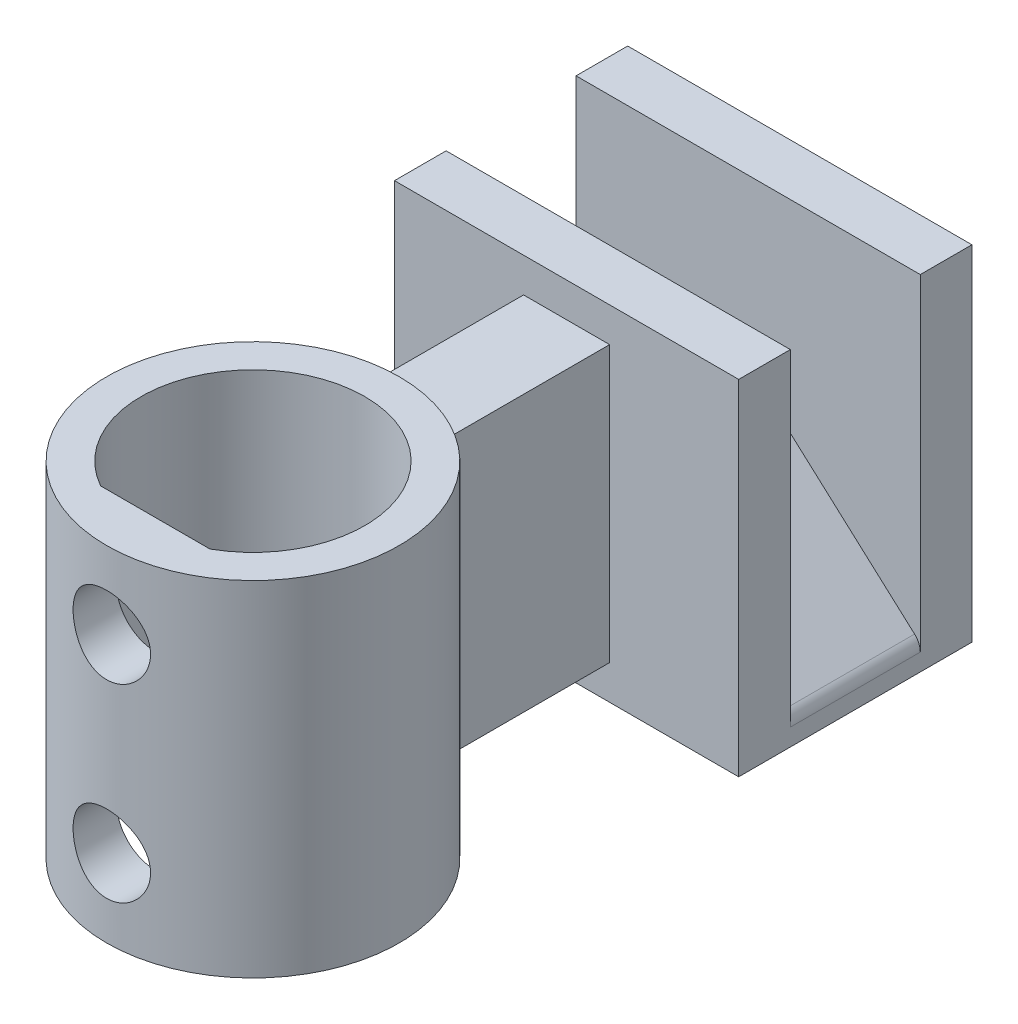
ISO-10303-21;
HEADER;
FILE_DESCRIPTION(('STEP AP214'),'2;1');
FILE_NAME('part.step','',(''),(''),'','','');
FILE_SCHEMA(('AUTOMOTIVE_DESIGN { 1 0 10303 214 1 1 1 1 }'));
ENDSEC;
DATA;
#1=APPLICATION_CONTEXT('core data for automotive mechanical design processes');
#2=APPLICATION_PROTOCOL_DEFINITION('international standard','automotive_design',2000,#1);
#3=PRODUCT_CONTEXT('',#1,'mechanical');
#4=PRODUCT('Part','Part','',(#3));
#5=PRODUCT_RELATED_PRODUCT_CATEGORY('part','',(#4));
#6=PRODUCT_DEFINITION_FORMATION('','',#4);
#7=PRODUCT_DEFINITION_CONTEXT('part definition',#1,'design');
#8=PRODUCT_DEFINITION('design','',#6,#7);
#9=PRODUCT_DEFINITION_SHAPE('','',#8);
#10=(LENGTH_UNIT() NAMED_UNIT(*) SI_UNIT(.MILLI.,.METRE.));
#11=(NAMED_UNIT(*) PLANE_ANGLE_UNIT() SI_UNIT($,.RADIAN.));
#12=(NAMED_UNIT(*) SI_UNIT($,.STERADIAN.) SOLID_ANGLE_UNIT());
#13=UNCERTAINTY_MEASURE_WITH_UNIT(LENGTH_MEASURE(1.E-05),#10,'distance_accuracy_value','');
#14=(GEOMETRIC_REPRESENTATION_CONTEXT(3) GLOBAL_UNCERTAINTY_ASSIGNED_CONTEXT((#13)) GLOBAL_UNIT_ASSIGNED_CONTEXT((#10,
#11,#12)) REPRESENTATION_CONTEXT('',''));
#15=CARTESIAN_POINT('',(0.,0.,0.));
#16=DIRECTION('',(0.,0.,1.));
#17=DIRECTION('',(1.,0.,0.));
#18=AXIS2_PLACEMENT_3D('',#15,#16,#17);
#19=CARTESIAN_POINT('',(0.,39.0416305603426,25.));
#20=DIRECTION('',(0.,-1.,0.));
#21=DIRECTION('',(0.,0.,-1.));
#22=AXIS2_PLACEMENT_3D('',#19,#20,#21);
#23=CYLINDRICAL_SURFACE('',#22,8.5);
#24=CARTESIAN_POINT('',(0.,15.,25.));
#25=DIRECTION('',(0.,-1.,0.));
#26=DIRECTION('',(0.,0.,-1.));
#27=AXIS2_PLACEMENT_3D('',#24,#25,#26);
#28=CIRCLE('',#27,8.5);
#29=CARTESIAN_POINT('',(0.,15.,16.5));
#30=VERTEX_POINT('',#29);
#31=EDGE_CURVE('E186',#30,#30,#28,.T.);
#32=ORIENTED_EDGE('',*,*,#31,.T.);
#33=EDGE_LOOP('',(#32));
#34=FACE_BOUND('',#33,.T.);
#35=CARTESIAN_POINT('',(0.,-5.,25.));
#36=DIRECTION('',(0.,1.,0.));
#37=DIRECTION('',(0.,0.,1.));
#38=AXIS2_PLACEMENT_3D('',#35,#36,#37);
#39=CIRCLE('',#38,8.5);
#40=CARTESIAN_POINT('',(0.,-5.,33.5));
#41=VERTEX_POINT('',#40);
#42=EDGE_CURVE('E192',#41,#41,#39,.F.);
#43=ORIENTED_EDGE('',*,*,#42,.F.);
#44=EDGE_LOOP('',(#43));
#45=FACE_BOUND('',#44,.T.);
#46=CARTESIAN_POINT('',(0.,-3.,25.));
#47=DIRECTION('',(0.,1.,0.));
#48=DIRECTION('',(0.,0.,1.));
#49=AXIS2_PLACEMENT_3D('',#46,#47,#48);
#50=CIRCLE('',#49,8.5);
#51=CARTESIAN_POINT('',(-2.5,-3.,16.875961595364));
#52=VERTEX_POINT('',#51);
#53=CARTESIAN_POINT('',(2.5,-3.,16.875961595364));
#54=VERTEX_POINT('',#53);
#55=EDGE_CURVE('E226',#52,#54,#50,.F.);
#56=ORIENTED_EDGE('',*,*,#55,.T.);
#57=DIRECTION('',(0.,-1.,0.));
#58=VECTOR('',#57,1.);
#59=CARTESIAN_POINT('',(2.5,39.0416305603426,16.875961595364));
#60=LINE('',#59,#58);
#61=CARTESIAN_POINT('',(2.5,13.,16.875961595364));
#62=VERTEX_POINT('',#61);
#63=EDGE_CURVE('E211',#54,#62,#60,.F.);
#64=ORIENTED_EDGE('',*,*,#63,.T.);
#65=CARTESIAN_POINT('',(0.,13.,25.));
#66=DIRECTION('',(0.,-1.,0.));
#67=DIRECTION('',(0.,0.,-1.));
#68=AXIS2_PLACEMENT_3D('',#65,#66,#67);
#69=CIRCLE('',#68,8.5);
#70=CARTESIAN_POINT('',(-2.5,13.,16.875961595364));
#71=VERTEX_POINT('',#70);
#72=EDGE_CURVE('E233',#62,#71,#69,.F.);
#73=ORIENTED_EDGE('',*,*,#72,.T.);
#74=DIRECTION('',(0.,-1.,0.));
#75=VECTOR('',#74,1.);
#76=CARTESIAN_POINT('',(-2.5,39.0416305603426,16.875961595364));
#77=LINE('',#76,#75);
#78=EDGE_CURVE('E230',#71,#52,#77,.T.);
#79=ORIENTED_EDGE('',*,*,#78,.T.);
#80=EDGE_LOOP('',(#56,#64,#73,#79));
#81=FACE_BOUND('',#80,.T.);
#82=CARTESIAN_POINT('',(-2.25,10.5,33.1967981553775));
#83=CARTESIAN_POINT('',(-2.24999694180408,10.6239840002776,33.1968003362435));
#84=CARTESIAN_POINT('',(-2.23971706610501,10.7480005412109,33.1996419584915));
#85=CARTESIAN_POINT('',(-2.198945615888,10.9924544608563,33.2106680196964));
#86=CARTESIAN_POINT('',(-2.16844370713168,11.112889976629,33.2188551904021));
#87=CARTESIAN_POINT('',(-2.0882990785985,11.3466102401079,33.2395815791112));
#88=CARTESIAN_POINT('',(-2.03868300476042,11.459904688051,33.2521147362105));
#89=CARTESIAN_POINT('',(-1.92180166354043,11.6765786826062,33.2801132198881));
#90=CARTESIAN_POINT('',(-1.85453509902009,11.7799574997535,33.2955787619447));
#91=CARTESIAN_POINT('',(-1.70248951742595,11.9764139017784,33.3281265446091));
#92=CARTESIAN_POINT('',(-1.61735395744878,12.0692109081865,33.3452371126252));
#93=CARTESIAN_POINT('',(-1.4327540142738,12.2393902103004,33.3789023677977));
#94=CARTESIAN_POINT('',(-1.33328816547564,12.3167709274061,33.3954569978831));
#95=CARTESIAN_POINT('',(-1.12090838569079,12.4550884366435,33.4264608929721));
#96=CARTESIAN_POINT('',(-1.00780712819347,12.5157466883929,33.4408728427373));
#97=CARTESIAN_POINT('',(-0.772566710508234,12.6170815196129,33.4656427357432));
#98=CARTESIAN_POINT('',(-0.650429055025734,12.6577614172222,33.4760013521304));
#99=CARTESIAN_POINT('',(-0.403511110172187,12.7170778425828,33.4912971460741));
#100=CARTESIAN_POINT('',(-0.278852839843893,12.7361915561904,33.4963515042717));
#101=CARTESIAN_POINT('',(-0.0280034780646866,12.7533339423421,33.5008788349257));
#102=CARTESIAN_POINT('',(0.0981873570184365,12.7513660941808,33.5003527283806));
#103=CARTESIAN_POINT('',(0.34519977639906,12.7267381177659,33.4938644304373));
#104=CARTESIAN_POINT('',(0.466076857336715,12.7045934898765,33.4880376721779));
#105=CARTESIAN_POINT('',(0.702334013138001,12.6410728615727,33.4717623278363));
#106=CARTESIAN_POINT('',(0.817713776487286,12.5996957727456,33.4613134801802));
#107=CARTESIAN_POINT('',(1.04102215095086,12.4984870248307,33.4367663576623));
#108=CARTESIAN_POINT('',(1.14886634833951,12.4384779194592,33.4226332115479));
#109=CARTESIAN_POINT('',(1.3531303740591,12.301844580475,33.3922415251126));
#110=CARTESIAN_POINT('',(1.44954799839656,12.2252171495074,33.375982576028));
#111=CARTESIAN_POINT('',(1.63129857081783,12.0547825542084,33.342521924539));
#112=CARTESIAN_POINT('',(1.71620777876131,11.9605256731685,33.3253065822884));
#113=CARTESIAN_POINT('',(1.86911637013184,11.7589321307718,33.2923181202052));
#114=CARTESIAN_POINT('',(1.93711475347608,11.6515946964081,33.2765450857034));
#115=CARTESIAN_POINT('',(2.05458778503724,11.4259787352489,33.2481731019722));
#116=CARTESIAN_POINT('',(2.10394886477225,11.3076384369629,33.2355937612802));
#117=CARTESIAN_POINT('',(2.18193716023719,11.0639230764637,33.2152779792318));
#118=CARTESIAN_POINT('',(2.21056943128527,10.9385497375025,33.207540357145));
#119=CARTESIAN_POINT('',(2.24556016825425,10.6882860893502,33.1980351929453));
#120=CARTESIAN_POINT('',(2.25255005779307,10.5634903897575,33.1960984643835));
#121=CARTESIAN_POINT('',(2.24579596911986,10.3145136151024,33.1979517680045));
#122=CARTESIAN_POINT('',(2.23205416085442,10.19033247708,33.2017412008412));
#123=CARTESIAN_POINT('',(2.18478304951454,9.94853203437677,33.2144565867633));
#124=CARTESIAN_POINT('',(2.15163187005439,9.83083314067768,33.2232843058655));
#125=CARTESIAN_POINT('',(2.06690749717098,9.60266578735862,33.2449859622244));
#126=CARTESIAN_POINT('',(2.0153319242454,9.49219826384843,33.2578604220901));
#127=CARTESIAN_POINT('',(1.89393612864426,9.27898360406455,33.2865532711528));
#128=CARTESIAN_POINT('',(1.82374430356199,9.17645600255329,33.3024294781708));
#129=CARTESIAN_POINT('',(1.66757023068808,8.98440278488017,33.3352002454647));
#130=CARTESIAN_POINT('',(1.58158505971235,8.89487958119961,33.3520949938724));
#131=CARTESIAN_POINT('',(1.39334723217788,8.72876291555247,33.3855805923336));
#132=CARTESIAN_POINT('',(1.29070161878611,8.65260935870141,33.4021491503459));
#133=CARTESIAN_POINT('',(1.07371678547403,8.51861464758931,33.4326221761272));
#134=CARTESIAN_POINT('',(0.959378187911347,8.46077251937521,33.4465267855714));
#135=CARTESIAN_POINT('',(0.723057226149525,8.36557056201773,33.470015772103));
#136=CARTESIAN_POINT('',(0.60113959611423,8.32805833034544,33.4796321961789));
#137=CARTESIAN_POINT('',(0.352439036803731,8.2741367860407,33.4936022569498));
#138=CARTESIAN_POINT('',(0.225657174963255,8.25772287044393,33.4979570415506));
#139=CARTESIAN_POINT('',(-0.0250604722587875,8.24674873433714,33.5008598374346));
#140=CARTESIAN_POINT('',(-0.148966409472797,8.2515427679478,33.499579436696));
#141=CARTESIAN_POINT('',(-0.394141954180563,8.28135153536109,33.4917428575153));
#142=CARTESIAN_POINT('',(-0.515411657917084,8.30636552970252,33.4851868720061));
#143=CARTESIAN_POINT('',(-0.751107699159933,8.37554121781611,33.4675689262979));
#144=CARTESIAN_POINT('',(-0.865574416324465,8.41957360028427,33.4565374265752));
#145=CARTESIAN_POINT('',(-1.08556048681217,8.5254205314973,33.4311229382255));
#146=CARTESIAN_POINT('',(-1.19107859706731,8.58723754551755,33.4167394850088));
#147=CARTESIAN_POINT('',(-1.39318530515942,8.72879850578497,33.3856885458129));
#148=CARTESIAN_POINT('',(-1.48946543719377,8.80897181418192,33.3689708718519));
#149=CARTESIAN_POINT('',(-1.66742398064291,8.98415288335479,33.3353414220771));
#150=CARTESIAN_POINT('',(-1.74909856114583,9.07916452389294,33.3184295965731));
#151=CARTESIAN_POINT('',(-1.8972708258445,9.2837921479421,33.285906991571));
#152=CARTESIAN_POINT('',(-1.96340296292341,9.39367904330234,33.2703321637851));
#153=CARTESIAN_POINT('',(-2.07615948784757,9.62341015894324,33.2427515934587));
#154=CARTESIAN_POINT('',(-2.12279681152532,9.74324771294936,33.2307434857482));
#155=CARTESIAN_POINT('',(-2.18903256232817,9.96889360228065,33.2133487458215));
#156=CARTESIAN_POINT('',(-2.21184214669942,10.0737109686333,33.2071920574266));
#157=CARTESIAN_POINT('',(-2.24232635318084,10.2856776239988,33.1989160421293));
#158=CARTESIAN_POINT('',(-2.25000264354342,10.3928266546586,33.1967962702092));
#159=CARTESIAN_POINT('',(-2.25,10.5,33.1967981553775));
#160=B_SPLINE_CURVE_WITH_KNOTS('',3,(#82,#83,#84,#85,#86,#87,#88,#89,#90,#91,#92,#93,#94,#95,
#96,#97,#98,#99,#100,#101,#102,#103,#104,#105,#106,#107,#108,#109,#110,#111,#112,#113,#114,#115,
#116,#117,#118,#119,#120,#121,#122,#123,#124,#125,#126,#127,#128,#129,#130,#131,#132,#133,#134,
#135,#136,#137,#138,#139,#140,#141,#142,#143,#144,#145,#146,#147,#148,#149,#150,#151,#152,#153,
#154,#155,#156,#157,#158,#159),.UNSPECIFIED.,.T.,.F.,(4,2,2,2,2,2,2,2,2,2,2,2,2,2,2,2,2,2,2,2,2,
2,2,2,2,2,2,2,2,2,2,2,2,2,2,2,2,2,4),(0.,0.37155797163531,0.743305970231715,1.11453760110695,
1.48579652152091,1.86532086241599,2.24488404596034,2.63043245150024,3.01591680090743,
3.39269333716487,3.76940769129443,4.13675920765004,4.50413151587257,4.87511584526133,
5.24617161521628,5.62845622010334,6.01076342740043,6.3953640456007,6.77987083621654,
7.15304843134813,7.52618696941451,7.89228731518204,8.25843495975225,8.63252754907452,
9.00668944894658,9.39148781847044,9.77626571779774,10.1581177737158,10.539886507824,
10.9101123860205,11.2803247253535,11.6480585642679,12.0158434024024,12.3933170752266,
12.7708896114263,13.156610044578,13.5420741241071,13.8632889681006,14.1844684002793),.UNSPECIFIED.);
#161=CARTESIAN_POINT('',(-2.25,10.5,33.1967981553775));
#162=VERTEX_POINT('',#161);
#163=EDGE_CURVE('E198',#162,#162,#160,.T.);
#164=ORIENTED_EDGE('',*,*,#163,.T.);
#165=EDGE_LOOP('',(#164));
#166=FACE_BOUND('',#165,.T.);
#167=CARTESIAN_POINT('',(-2.25,-0.500000000000002,33.1967981553775));
#168=CARTESIAN_POINT('',(-2.24999694180408,-0.376015999722374,33.1968003362435));
#169=CARTESIAN_POINT('',(-2.23971706610501,-0.251999458789078,33.1996419584915));
#170=CARTESIAN_POINT('',(-2.198945615888,-0.00754553914369019,33.2106680196964));
#171=CARTESIAN_POINT('',(-2.16844370713168,0.112889976628972,33.2188551904021));
#172=CARTESIAN_POINT('',(-2.0882990785985,0.346610240107896,33.2395815791112));
#173=CARTESIAN_POINT('',(-2.03868300476042,0.459904688051024,33.2521147362105));
#174=CARTESIAN_POINT('',(-1.92180166354043,0.676578682606188,33.2801132198881));
#175=CARTESIAN_POINT('',(-1.85453509902009,0.779957499753548,33.2955787619447));
#176=CARTESIAN_POINT('',(-1.70248951742595,0.976413901778359,33.3281265446091));
#177=CARTESIAN_POINT('',(-1.61735395744878,1.06921090818649,33.3452371126252));
#178=CARTESIAN_POINT('',(-1.4327540142738,1.23939021030035,33.3789023677977));
#179=CARTESIAN_POINT('',(-1.33328816547564,1.31677092740614,33.3954569978831));
#180=CARTESIAN_POINT('',(-1.12090838569079,1.45508843664353,33.426460892972));
#181=CARTESIAN_POINT('',(-1.00780712819347,1.51574668839292,33.4408728427372));
#182=CARTESIAN_POINT('',(-0.772566710508234,1.6170815196129,33.4656427357431));
#183=CARTESIAN_POINT('',(-0.650429055025735,1.65776141722221,33.4760013521304));
#184=CARTESIAN_POINT('',(-0.403511110172187,1.71707784258281,33.4912971460741));
#185=CARTESIAN_POINT('',(-0.278852839843893,1.73619155619042,33.4963515042717));
#186=CARTESIAN_POINT('',(-0.0280034780646869,1.75333394234214,33.5008788349257));
#187=CARTESIAN_POINT('',(0.0981873570184361,1.75136609418084,33.5003527283806));
#188=CARTESIAN_POINT('',(0.34519977639906,1.72673811776592,33.4938644304373));
#189=CARTESIAN_POINT('',(0.466076857336715,1.70459348987647,33.4880376721779));
#190=CARTESIAN_POINT('',(0.702334013138001,1.6410728615727,33.4717623278363));
#191=CARTESIAN_POINT('',(0.817713776487285,1.59969577274563,33.4613134801802));
#192=CARTESIAN_POINT('',(1.04102215095086,1.49848702483075,33.4367663576623));
#193=CARTESIAN_POINT('',(1.14886634833951,1.43847791945919,33.4226332115479));
#194=CARTESIAN_POINT('',(1.3531303740591,1.30184458047502,33.3922415251126));
#195=CARTESIAN_POINT('',(1.44954799839656,1.22521714950741,33.375982576028));
#196=CARTESIAN_POINT('',(1.63129857081783,1.05478255420836,33.342521924539));
#197=CARTESIAN_POINT('',(1.71620777876131,0.960525673168511,33.3253065822884));
#198=CARTESIAN_POINT('',(1.86911637013183,0.758932130771777,33.2923181202052));
#199=CARTESIAN_POINT('',(1.93711475347608,0.651594696408099,33.2765450857034));
#200=CARTESIAN_POINT('',(2.05458778503724,0.425978735248875,33.2481731019722));
#201=CARTESIAN_POINT('',(2.10394886477225,0.307638436962872,33.2355937612802));
#202=CARTESIAN_POINT('',(2.18193716023719,0.0639230764637289,33.2152779792318));
#203=CARTESIAN_POINT('',(2.21056943128527,-0.0614502624975041,33.207540357145));
#204=CARTESIAN_POINT('',(2.24556016825425,-0.311713910649751,33.1980351929453));
#205=CARTESIAN_POINT('',(2.25255005779307,-0.436509610242537,33.1960984643835));
#206=CARTESIAN_POINT('',(2.24579596911986,-0.685486384897617,33.1979517680045));
#207=CARTESIAN_POINT('',(2.23205416085442,-0.809667522920008,33.2017412008412));
#208=CARTESIAN_POINT('',(2.18478304951454,-1.05146796562323,33.2144565867633));
#209=CARTESIAN_POINT('',(2.15163187005439,-1.16916685932232,33.2232843058654));
#210=CARTESIAN_POINT('',(2.06690749717098,-1.39733421264138,33.2449859622244));
#211=CARTESIAN_POINT('',(2.0153319242454,-1.50780173615157,33.2578604220901));
#212=CARTESIAN_POINT('',(1.89393612864426,-1.72101639593545,33.2865532711528));
#213=CARTESIAN_POINT('',(1.82374430356199,-1.82354399744671,33.3024294781708));
#214=CARTESIAN_POINT('',(1.66757023068808,-2.01559721511983,33.3352002454647));
#215=CARTESIAN_POINT('',(1.58158505971235,-2.10512041880039,33.3520949938724));
#216=CARTESIAN_POINT('',(1.39334723217788,-2.27123708444753,33.3855805923336));
#217=CARTESIAN_POINT('',(1.29070161878611,-2.34739064129859,33.4021491503459));
#218=CARTESIAN_POINT('',(1.07371678547403,-2.48138535241069,33.4326221761272));
#219=CARTESIAN_POINT('',(0.959378187911347,-2.53922748062479,33.4465267855714));
#220=CARTESIAN_POINT('',(0.723057226149525,-2.63442943798227,33.470015772103));
#221=CARTESIAN_POINT('',(0.60113959611423,-2.67194166965456,33.4796321961789));
#222=CARTESIAN_POINT('',(0.352439036803731,-2.7258632139593,33.4936022569498));
#223=CARTESIAN_POINT('',(0.225657174963256,-2.74227712955607,33.4979570415506));
#224=CARTESIAN_POINT('',(-0.0250604722587871,-2.75325126566286,33.5008598374346));
#225=CARTESIAN_POINT('',(-0.148966409472797,-2.7484572320522,33.499579436696));
#226=CARTESIAN_POINT('',(-0.394141954180563,-2.71864846463891,33.4917428575153));
#227=CARTESIAN_POINT('',(-0.515411657917083,-2.69363447029748,33.4851868720061));
#228=CARTESIAN_POINT('',(-0.751107699159933,-2.62445878218389,33.4675689262979));
#229=CARTESIAN_POINT('',(-0.865574416324465,-2.58042639971573,33.4565374265752));
#230=CARTESIAN_POINT('',(-1.08556048681217,-2.4745794685027,33.4311229382255));
#231=CARTESIAN_POINT('',(-1.19107859706731,-2.41276245448245,33.4167394850088));
#232=CARTESIAN_POINT('',(-1.39318530515942,-2.27120149421503,33.3856885458129));
#233=CARTESIAN_POINT('',(-1.48946543719377,-2.19102818581808,33.3689708718519));
#234=CARTESIAN_POINT('',(-1.66742398064291,-2.01584711664521,33.3353414220771));
#235=CARTESIAN_POINT('',(-1.74909856114582,-1.92083547610706,33.3184295965731));
#236=CARTESIAN_POINT('',(-1.8972708258445,-1.7162078520579,33.285906991571));
#237=CARTESIAN_POINT('',(-1.96340296292341,-1.60632095669767,33.2703321637851));
#238=CARTESIAN_POINT('',(-2.07615948784757,-1.37658984105676,33.2427515934587));
#239=CARTESIAN_POINT('',(-2.12279681152532,-1.25675228705065,33.2307434857482));
#240=CARTESIAN_POINT('',(-2.18903256232817,-1.03110639771935,33.2133487458215));
#241=CARTESIAN_POINT('',(-2.21184214669942,-0.92628903136672,33.2071920574266));
#242=CARTESIAN_POINT('',(-2.24232635318084,-0.714322376001232,33.1989160421293));
#243=CARTESIAN_POINT('',(-2.25000264354342,-0.607173345341352,33.1967962702092));
#244=CARTESIAN_POINT('',(-2.25,-0.500000000000002,33.1967981553775));
#245=B_SPLINE_CURVE_WITH_KNOTS('',3,(#167,#168,#169,#170,#171,#172,#173,#174,#175,#176,#177,
#178,#179,#180,#181,#182,#183,#184,#185,#186,#187,#188,#189,#190,#191,#192,#193,#194,#195,#196,
#197,#198,#199,#200,#201,#202,#203,#204,#205,#206,#207,#208,#209,#210,#211,#212,#213,#214,#215,
#216,#217,#218,#219,#220,#221,#222,#223,#224,#225,#226,#227,#228,#229,#230,#231,#232,#233,#234,
#235,#236,#237,#238,#239,#240,#241,#242,#243,#244),.UNSPECIFIED.,.T.,.F.,(4,2,2,2,2,2,2,2,2,2,2,
2,2,2,2,2,2,2,2,2,2,2,2,2,2,2,2,2,2,2,2,2,2,2,2,2,2,2,4),(0.,0.371557971635309,
0.743305970231715,1.11453760110695,1.48579652152091,1.86532086241599,2.24488404596033,
2.63043245150024,3.01591680090743,3.39269333716487,3.76940769129443,4.13675920765004,
4.50413151587256,4.87511584526133,5.24617161521628,5.62845622010334,6.01076342740043,
6.3953640456007,6.77987083621654,7.15304843134812,7.5261869694145,7.89228731518204,
8.25843495975225,8.63252754907452,9.00668944894658,9.39148781847044,9.77626571779773,
10.1581177737158,10.539886507824,10.9101123860205,11.2803247253535,11.6480585642679,
12.0158434024024,12.3933170752266,12.7708896114263,13.156610044578,13.5420741241071,
13.8632889681006,14.1844684002793),.UNSPECIFIED.);
#246=CARTESIAN_POINT('',(-2.25,-0.500000000000002,33.1967981553775));
#247=VERTEX_POINT('',#246);
#248=EDGE_CURVE('E616',#247,#247,#245,.T.);
#249=ORIENTED_EDGE('',*,*,#248,.T.);
#250=EDGE_LOOP('',(#249));
#251=FACE_BOUND('',#250,.T.);
#252=ADVANCED_FACE('F35',(#34,#45,#81,#166,#251),#23,.T.);
#253=CARTESIAN_POINT('',(0.,0.,6.775));
#254=DIRECTION('',(0.,0.,1.));
#255=DIRECTION('',(1.,0.,0.));
#256=AXIS2_PLACEMENT_3D('',#253,#254,#255);
#257=PLANE('',#256);
#258=DIRECTION('',(0.,1.,0.));
#259=VECTOR('',#258,1.);
#260=CARTESIAN_POINT('',(10.,15.,6.775));
#261=LINE('',#260,#259);
#262=CARTESIAN_POINT('',(10.,-5.,6.775));
#263=VERTEX_POINT('',#262);
#264=CARTESIAN_POINT('',(10.,15.,6.775));
#265=VERTEX_POINT('',#264);
#266=EDGE_CURVE('E263',#263,#265,#261,.T.);
#267=ORIENTED_EDGE('',*,*,#266,.T.);
#268=DIRECTION('',(-1.,0.,0.));
#269=VECTOR('',#268,1.);
#270=CARTESIAN_POINT('',(-10.,15.,6.775));
#271=LINE('',#270,#269);
#272=CARTESIAN_POINT('',(-10.,15.,6.775));
#273=VERTEX_POINT('',#272);
#274=EDGE_CURVE('E266',#265,#273,#271,.T.);
#275=ORIENTED_EDGE('',*,*,#274,.T.);
#276=DIRECTION('',(0.,-1.,0.));
#277=VECTOR('',#276,1.);
#278=CARTESIAN_POINT('',(-10.,15.,6.775));
#279=LINE('',#278,#277);
#280=CARTESIAN_POINT('',(-10.,-5.,6.775));
#281=VERTEX_POINT('',#280);
#282=EDGE_CURVE('E269',#273,#281,#279,.T.);
#283=ORIENTED_EDGE('',*,*,#282,.T.);
#284=DIRECTION('',(1.,0.,0.));
#285=VECTOR('',#284,1.);
#286=CARTESIAN_POINT('',(-10.,-5.,6.775));
#287=LINE('',#286,#285);
#288=EDGE_CURVE('E272',#281,#263,#287,.T.);
#289=ORIENTED_EDGE('',*,*,#288,.T.);
#290=EDGE_LOOP('',(#267,#275,#283,#289));
#291=FACE_BOUND('',#290,.T.);
#292=DIRECTION('',(-1.,0.,0.));
#293=VECTOR('',#292,1.);
#294=CARTESIAN_POINT('',(-2.5,13.,6.775));
#295=LINE('',#294,#293);
#296=CARTESIAN_POINT('',(2.5,13.,6.775));
#297=VERTEX_POINT('',#296);
#298=CARTESIAN_POINT('',(-2.5,13.,6.775));
#299=VERTEX_POINT('',#298);
#300=EDGE_CURVE('E215',#297,#299,#295,.T.);
#301=ORIENTED_EDGE('',*,*,#300,.F.);
#302=DIRECTION('',(0.,1.,0.));
#303=VECTOR('',#302,1.);
#304=CARTESIAN_POINT('',(2.5,13.,6.775));
#305=LINE('',#304,#303);
#306=CARTESIAN_POINT('',(2.5,-3.,6.775));
#307=VERTEX_POINT('',#306);
#308=EDGE_CURVE('E219',#307,#297,#305,.T.);
#309=ORIENTED_EDGE('',*,*,#308,.F.);
#310=DIRECTION('',(1.,0.,0.));
#311=VECTOR('',#310,1.);
#312=CARTESIAN_POINT('',(-2.5,-3.,6.775));
#313=LINE('',#312,#311);
#314=CARTESIAN_POINT('',(-2.5,-3.,6.775));
#315=VERTEX_POINT('',#314);
#316=EDGE_CURVE('E208',#315,#307,#313,.T.);
#317=ORIENTED_EDGE('',*,*,#316,.F.);
#318=DIRECTION('',(0.,-1.,0.));
#319=VECTOR('',#318,1.);
#320=CARTESIAN_POINT('',(-2.5,13.,6.775));
#321=LINE('',#320,#319);
#322=EDGE_CURVE('E52',#299,#315,#321,.T.);
#323=ORIENTED_EDGE('',*,*,#322,.F.);
#324=EDGE_LOOP('',(#301,#309,#317,#323));
#325=FACE_BOUND('',#324,.T.);
#326=ADVANCED_FACE('F396',(#291,#325),#257,.T.);
#327=CARTESIAN_POINT('',(10.,-5.,3.775));
#328=DIRECTION('',(-1.,0.,0.));
#329=DIRECTION('',(0.,0.,1.));
#330=AXIS2_PLACEMENT_3D('',#327,#328,#329);
#331=PLANE('',#330);
#332=DIRECTION('',(0.,0.,-1.));
#333=VECTOR('',#332,1.);
#334=CARTESIAN_POINT('',(10.,-5.,3.775));
#335=LINE('',#334,#333);
#336=CARTESIAN_POINT('',(10.,-5.,-6.775));
#337=VERTEX_POINT('',#336);
#338=EDGE_CURVE('E290',#263,#337,#335,.T.);
#339=ORIENTED_EDGE('',*,*,#338,.T.);
#340=DIRECTION('',(0.,1.,0.));
#341=VECTOR('',#340,1.);
#342=CARTESIAN_POINT('',(10.,15.,-6.775));
#343=LINE('',#342,#341);
#344=CARTESIAN_POINT('',(10.,15.,-6.775));
#345=VERTEX_POINT('',#344);
#346=EDGE_CURVE('E238',#337,#345,#343,.T.);
#347=ORIENTED_EDGE('',*,*,#346,.T.);
#348=DIRECTION('',(0.,0.,1.));
#349=VECTOR('',#348,1.);
#350=CARTESIAN_POINT('',(10.,15.,-6.775));
#351=LINE('',#350,#349);
#352=CARTESIAN_POINT('',(10.,15.,-3.775));
#353=VERTEX_POINT('',#352);
#354=EDGE_CURVE('E251',#345,#353,#351,.T.);
#355=ORIENTED_EDGE('',*,*,#354,.T.);
#356=DIRECTION('',(0.,1.,0.));
#357=VECTOR('',#356,1.);
#358=CARTESIAN_POINT('',(10.,15.,-3.775));
#359=LINE('',#358,#357);
#360=CARTESIAN_POINT('',(10.,-3.99906710613801,-3.775));
#361=VERTEX_POINT('',#360);
#362=EDGE_CURVE('E229',#361,#353,#359,.T.);
#363=ORIENTED_EDGE('',*,*,#362,.F.);
#364=DIRECTION('',(0.,0.,-1.));
#365=VECTOR('',#364,1.);
#366=CARTESIAN_POINT('',(10.,-3.99906710613801,3.775));
#367=LINE('',#366,#365);
#368=CARTESIAN_POINT('',(10.,-3.99906710613801,3.775));
#369=VERTEX_POINT('',#368);
#370=EDGE_CURVE('E336',#361,#369,#367,.F.);
#371=ORIENTED_EDGE('',*,*,#370,.T.);
#372=DIRECTION('',(0.,1.,0.));
#373=VECTOR('',#372,1.);
#374=CARTESIAN_POINT('',(10.,15.,3.775));
#375=LINE('',#374,#373);
#376=CARTESIAN_POINT('',(10.,15.,3.775));
#377=VERTEX_POINT('',#376);
#378=EDGE_CURVE('E262',#369,#377,#375,.T.);
#379=ORIENTED_EDGE('',*,*,#378,.T.);
#380=DIRECTION('',(0.,0.,-1.));
#381=VECTOR('',#380,1.);
#382=CARTESIAN_POINT('',(10.,15.,6.775));
#383=LINE('',#382,#381);
#384=EDGE_CURVE('E283',#265,#377,#383,.T.);
#385=ORIENTED_EDGE('',*,*,#384,.F.);
#386=ORIENTED_EDGE('',*,*,#266,.F.);
#387=EDGE_LOOP('',(#339,#347,#355,#363,#371,#379,#385,#386));
#388=FACE_BOUND('',#387,.T.);
#389=ADVANCED_FACE('F374',(#388),#331,.F.);
#390=CARTESIAN_POINT('',(-10.,5.,3.775));
#391=DIRECTION('',(0.,-1.,0.));
#392=DIRECTION('',(0.,0.,-1.));
#393=AXIS2_PLACEMENT_3D('',#390,#391,#392);
#394=PLANE('',#393);
#395=DIRECTION('',(-1.,0.,0.));
#396=VECTOR('',#395,1.);
#397=CARTESIAN_POINT('',(-10.,5.,3.775));
#398=LINE('',#397,#396);
#399=CARTESIAN_POINT('',(0.116135964964558,5.,3.775));
#400=VERTEX_POINT('',#399);
#401=CARTESIAN_POINT('',(-0.116135964964551,5.,3.775));
#402=VERTEX_POINT('',#401);
#403=EDGE_CURVE('E287',#400,#402,#398,.T.);
#404=ORIENTED_EDGE('',*,*,#403,.F.);
#405=DIRECTION('',(0.,0.,1.));
#406=VECTOR('',#405,1.);
#407=CARTESIAN_POINT('',(0.116135964964558,5.,-3.775));
#408=LINE('',#407,#406);
#409=CARTESIAN_POINT('',(0.116135964964558,5.,-3.775));
#410=VERTEX_POINT('',#409);
#411=EDGE_CURVE('E11',#400,#410,#408,.F.);
#412=ORIENTED_EDGE('',*,*,#411,.T.);
#413=DIRECTION('',(-1.,0.,0.));
#414=VECTOR('',#413,1.);
#415=CARTESIAN_POINT('',(-10.,5.,-3.775));
#416=LINE('',#415,#414);
#417=CARTESIAN_POINT('',(-0.116135964964551,5.,-3.775));
#418=VERTEX_POINT('',#417);
#419=EDGE_CURVE('E286',#410,#418,#416,.T.);
#420=ORIENTED_EDGE('',*,*,#419,.T.);
#421=DIRECTION('',(0.,0.,-1.));
#422=VECTOR('',#421,1.);
#423=CARTESIAN_POINT('',(-0.116135964964551,5.,3.775));
#424=LINE('',#423,#422);
#425=EDGE_CURVE('E44',#418,#402,#424,.F.);
#426=ORIENTED_EDGE('',*,*,#425,.T.);
#427=EDGE_LOOP('',(#404,#412,#420,#426));
#428=FACE_BOUND('',#427,.T.);
#429=ADVANCED_FACE('F344',(#428),#394,.F.);
#430=CARTESIAN_POINT('',(-10.,-5.,3.775));
#431=DIRECTION('',(1.,0.,0.));
#432=DIRECTION('',(0.,0.,-1.));
#433=AXIS2_PLACEMENT_3D('',#430,#431,#432);
#434=PLANE('',#433);
#435=DIRECTION('',(0.,0.,-1.));
#436=VECTOR('',#435,1.);
#437=CARTESIAN_POINT('',(-10.,-5.,3.775));
#438=LINE('',#437,#436);
#439=CARTESIAN_POINT('',(-10.,-5.,-6.775));
#440=VERTEX_POINT('',#439);
#441=EDGE_CURVE('E293',#281,#440,#438,.T.);
#442=ORIENTED_EDGE('',*,*,#441,.F.);
#443=ORIENTED_EDGE('',*,*,#282,.F.);
#444=DIRECTION('',(0.,0.,-1.));
#445=VECTOR('',#444,1.);
#446=CARTESIAN_POINT('',(-10.,15.,6.775));
#447=LINE('',#446,#445);
#448=CARTESIAN_POINT('',(-10.,15.,3.775));
#449=VERTEX_POINT('',#448);
#450=EDGE_CURVE('E275',#273,#449,#447,.T.);
#451=ORIENTED_EDGE('',*,*,#450,.T.);
#452=DIRECTION('',(0.,-1.,0.));
#453=VECTOR('',#452,1.);
#454=CARTESIAN_POINT('',(-10.,15.,3.775));
#455=LINE('',#454,#453);
#456=CARTESIAN_POINT('',(-10.,-3.99906710613801,3.775));
#457=VERTEX_POINT('',#456);
#458=EDGE_CURVE('E267',#449,#457,#455,.T.);
#459=ORIENTED_EDGE('',*,*,#458,.T.);
#460=DIRECTION('',(0.,0.,1.));
#461=VECTOR('',#460,1.);
#462=CARTESIAN_POINT('',(-10.,-3.99906710613801,-3.775));
#463=LINE('',#462,#461);
#464=CARTESIAN_POINT('',(-10.,-3.99906710613801,-3.775));
#465=VERTEX_POINT('',#464);
#466=EDGE_CURVE('E307',#457,#465,#463,.F.);
#467=ORIENTED_EDGE('',*,*,#466,.T.);
#468=DIRECTION('',(0.,-1.,0.));
#469=VECTOR('',#468,1.);
#470=CARTESIAN_POINT('',(-10.,15.,-3.775));
#471=LINE('',#470,#469);
#472=CARTESIAN_POINT('',(-10.,15.,-3.775));
#473=VERTEX_POINT('',#472);
#474=EDGE_CURVE('E253',#473,#465,#471,.T.);
#475=ORIENTED_EDGE('',*,*,#474,.F.);
#476=DIRECTION('',(0.,0.,1.));
#477=VECTOR('',#476,1.);
#478=CARTESIAN_POINT('',(-10.,15.,-6.775));
#479=LINE('',#478,#477);
#480=CARTESIAN_POINT('',(-10.,15.,-6.775));
#481=VERTEX_POINT('',#480);
#482=EDGE_CURVE('E260',#481,#473,#479,.T.);
#483=ORIENTED_EDGE('',*,*,#482,.F.);
#484=DIRECTION('',(0.,-1.,0.));
#485=VECTOR('',#484,1.);
#486=CARTESIAN_POINT('',(-10.,15.,-6.775));
#487=LINE('',#486,#485);
#488=EDGE_CURVE('E245',#481,#440,#487,.T.);
#489=ORIENTED_EDGE('',*,*,#488,.T.);
#490=EDGE_LOOP('',(#442,#443,#451,#459,#467,#475,#483,#489));
#491=FACE_BOUND('',#490,.T.);
#492=ADVANCED_FACE('F365',(#491),#434,.F.);
#493=CARTESIAN_POINT('',(-10.,-5.,3.775));
#494=DIRECTION('',(0.,1.,0.));
#495=DIRECTION('',(0.,0.,1.));
#496=AXIS2_PLACEMENT_3D('',#493,#494,#495);
#497=PLANE('',#496);
#498=ORIENTED_EDGE('',*,*,#441,.T.);
#499=DIRECTION('',(1.,0.,0.));
#500=VECTOR('',#499,1.);
#501=CARTESIAN_POINT('',(-10.,-5.,-6.775));
#502=LINE('',#501,#500);
#503=EDGE_CURVE('E241',#440,#337,#502,.T.);
#504=ORIENTED_EDGE('',*,*,#503,.T.);
#505=ORIENTED_EDGE('',*,*,#338,.F.);
#506=ORIENTED_EDGE('',*,*,#288,.F.);
#507=EDGE_LOOP('',(#498,#504,#505,#506));
#508=FACE_BOUND('',#507,.T.);
#509=ADVANCED_FACE('F384',(#508),#497,.F.);
#510=CARTESIAN_POINT('',(0.499999999999971,5.,3.775));
#511=DIRECTION('',(-0.669130606358857,-0.743144825477395,0.));
#512=DIRECTION('',(0.,0.,-1.));
#513=AXIS2_PLACEMENT_3D('',#510,#511,#512);
#514=PLANE('',#513);
#515=DIRECTION('',(0.743144825477395,-0.669130606358857,0.));
#516=VECTOR('',#515,1.);
#517=CARTESIAN_POINT('',(0.499999999999971,5.,3.775));
#518=LINE('',#517,#516);
#519=CARTESIAN_POINT('',(9.66913060635886,-3.25592228066062,3.775));
#520=VERTEX_POINT('',#519);
#521=CARTESIAN_POINT('',(0.785266571323414,4.7431448254774,3.775));
#522=VERTEX_POINT('',#521);
#523=EDGE_CURVE('E304',#520,#522,#518,.F.);
#524=ORIENTED_EDGE('',*,*,#523,.F.);
#525=DIRECTION('',(0.,0.,1.));
#526=VECTOR('',#525,1.);
#527=CARTESIAN_POINT('',(9.66913060635886,-3.25592228066062,-3.775));
#528=LINE('',#527,#526);
#529=CARTESIAN_POINT('',(9.66913060635886,-3.25592228066062,-3.775));
#530=VERTEX_POINT('',#529);
#531=EDGE_CURVE('E341',#520,#530,#528,.F.);
#532=ORIENTED_EDGE('',*,*,#531,.T.);
#533=DIRECTION('',(-0.743144825477395,0.669130606358857,0.));
#534=VECTOR('',#533,1.);
#535=CARTESIAN_POINT('',(2.71017262260376,3.0099516320112,-3.775));
#536=LINE('',#535,#534);
#537=CARTESIAN_POINT('',(0.785266571323414,4.7431448254774,-3.775));
#538=VERTEX_POINT('',#537);
#539=EDGE_CURVE('E298',#538,#530,#536,.F.);
#540=ORIENTED_EDGE('',*,*,#539,.F.);
#541=DIRECTION('',(0.,0.,-1.));
#542=VECTOR('',#541,1.);
#543=CARTESIAN_POINT('',(0.785266571323414,4.7431448254774,3.775));
#544=LINE('',#543,#542);
#545=EDGE_CURVE('E339',#538,#522,#544,.F.);
#546=ORIENTED_EDGE('',*,*,#545,.T.);
#547=EDGE_LOOP('',(#524,#532,#540,#546));
#548=FACE_BOUND('',#547,.T.);
#549=ADVANCED_FACE('F382',(#548),#514,.F.);
#550=CARTESIAN_POINT('',(-10.,-3.55383842082948,3.775));
#551=DIRECTION('',(0.669130606358857,-0.743144825477395,0.));
#552=DIRECTION('',(0.,0.,-1.));
#553=AXIS2_PLACEMENT_3D('',#550,#551,#552);
#554=PLANE('',#553);
#555=DIRECTION('',(-0.743144825477395,-0.669130606358857,0.));
#556=VECTOR('',#555,1.);
#557=CARTESIAN_POINT('',(-2.71017262260375,3.00995163201119,-3.775));
#558=LINE('',#557,#556);
#559=CARTESIAN_POINT('',(-9.66913060635885,-3.25592228066062,-3.775));
#560=VERTEX_POINT('',#559);
#561=CARTESIAN_POINT('',(-0.785266571323407,4.74314482547739,-3.775));
#562=VERTEX_POINT('',#561);
#563=EDGE_CURVE('E295',#560,#562,#558,.F.);
#564=ORIENTED_EDGE('',*,*,#563,.F.);
#565=DIRECTION('',(0.,0.,-1.));
#566=VECTOR('',#565,1.);
#567=CARTESIAN_POINT('',(-9.66913060635885,-3.25592228066062,3.775));
#568=LINE('',#567,#566);
#569=CARTESIAN_POINT('',(-9.66913060635885,-3.25592228066062,3.775));
#570=VERTEX_POINT('',#569);
#571=EDGE_CURVE('E324',#560,#570,#568,.F.);
#572=ORIENTED_EDGE('',*,*,#571,.T.);
#573=DIRECTION('',(0.743144825477395,0.669130606358857,0.));
#574=VECTOR('',#573,1.);
#575=CARTESIAN_POINT('',(-10.,-3.55383842082948,3.775));
#576=LINE('',#575,#574);
#577=CARTESIAN_POINT('',(-0.785266571323407,4.7431448254774,3.775));
#578=VERTEX_POINT('',#577);
#579=EDGE_CURVE('E301',#578,#570,#576,.F.);
#580=ORIENTED_EDGE('',*,*,#579,.F.);
#581=DIRECTION('',(0.,0.,1.));
#582=VECTOR('',#581,1.);
#583=CARTESIAN_POINT('',(-0.785266571323407,4.7431448254774,-3.775));
#584=LINE('',#583,#582);
#585=EDGE_CURVE('E322',#578,#562,#584,.F.);
#586=ORIENTED_EDGE('',*,*,#585,.T.);
#587=EDGE_LOOP('',(#564,#572,#580,#586));
#588=FACE_BOUND('',#587,.T.);
#589=ADVANCED_FACE('F358',(#588),#554,.F.);
#590=CARTESIAN_POINT('',(-9.,-3.99906710613801,3.775));
#591=DIRECTION('',(0.,0.,-1.));
#592=DIRECTION('',(-1.,0.,0.));
#593=AXIS2_PLACEMENT_3D('',#590,#591,#592);
#594=CYLINDRICAL_SURFACE('',#593,1.);
#595=CARTESIAN_POINT('',(-9.,-3.99906710613801,3.775));
#596=DIRECTION('',(0.,0.,-1.));
#597=DIRECTION('',(-1.,0.,0.));
#598=AXIS2_PLACEMENT_3D('',#595,#596,#597);
#599=CIRCLE('',#598,1.);
#600=EDGE_CURVE('E333',#570,#457,#599,.F.);
#601=ORIENTED_EDGE('',*,*,#600,.F.);
#602=ORIENTED_EDGE('',*,*,#571,.F.);
#603=CARTESIAN_POINT('',(-9.,-3.99906710613801,-3.775));
#604=DIRECTION('',(0.,0.,-1.));
#605=DIRECTION('',(-1.,0.,0.));
#606=AXIS2_PLACEMENT_3D('',#603,#604,#605);
#607=CIRCLE('',#606,1.);
#608=EDGE_CURVE('E319',#465,#560,#607,.T.);
#609=ORIENTED_EDGE('',*,*,#608,.F.);
#610=ORIENTED_EDGE('',*,*,#466,.F.);
#611=EDGE_LOOP('',(#601,#602,#609,#610));
#612=FACE_BOUND('',#611,.T.);
#613=ADVANCED_FACE('F390',(#612),#594,.T.);
#614=CARTESIAN_POINT('',(9.00000000000001,-3.99906710613801,3.775));
#615=DIRECTION('',(0.,0.,1.));
#616=DIRECTION('',(1.,0.,0.));
#617=AXIS2_PLACEMENT_3D('',#614,#615,#616);
#618=CYLINDRICAL_SURFACE('',#617,1.);
#619=CARTESIAN_POINT('',(9.00000000000001,-3.99906710613801,-3.775));
#620=DIRECTION('',(0.,0.,-1.));
#621=DIRECTION('',(-1.,0.,0.));
#622=AXIS2_PLACEMENT_3D('',#619,#620,#621);
#623=CIRCLE('',#622,1.);
#624=EDGE_CURVE('E316',#530,#361,#623,.T.);
#625=ORIENTED_EDGE('',*,*,#624,.F.);
#626=ORIENTED_EDGE('',*,*,#531,.F.);
#627=CARTESIAN_POINT('',(9.00000000000001,-3.99906710613801,3.775));
#628=DIRECTION('',(0.,0.,-1.));
#629=DIRECTION('',(-1.,0.,0.));
#630=AXIS2_PLACEMENT_3D('',#627,#628,#629);
#631=CIRCLE('',#630,1.);
#632=EDGE_CURVE('E330',#369,#520,#631,.F.);
#633=ORIENTED_EDGE('',*,*,#632,.F.);
#634=ORIENTED_EDGE('',*,*,#370,.F.);
#635=EDGE_LOOP('',(#625,#626,#633,#634));
#636=FACE_BOUND('',#635,.T.);
#637=ADVANCED_FACE('F379',(#636),#618,.T.);
#638=CARTESIAN_POINT('',(0.116135964964558,4.,3.775));
#639=DIRECTION('',(0.,0.,-1.));
#640=DIRECTION('',(-1.,0.,0.));
#641=AXIS2_PLACEMENT_3D('',#638,#639,#640);
#642=CYLINDRICAL_SURFACE('',#641,1.);
#643=CARTESIAN_POINT('',(0.116135964964558,4.,3.775));
#644=DIRECTION('',(0.,0.,-1.));
#645=DIRECTION('',(-1.,0.,0.));
#646=AXIS2_PLACEMENT_3D('',#643,#644,#645);
#647=CIRCLE('',#646,1.);
#648=EDGE_CURVE('E327',#522,#400,#647,.F.);
#649=ORIENTED_EDGE('',*,*,#648,.F.);
#650=ORIENTED_EDGE('',*,*,#545,.F.);
#651=CARTESIAN_POINT('',(0.116135964964558,4.,-3.775));
#652=DIRECTION('',(0.,0.,-1.));
#653=DIRECTION('',(-1.,0.,0.));
#654=AXIS2_PLACEMENT_3D('',#651,#652,#653);
#655=CIRCLE('',#654,1.);
#656=EDGE_CURVE('E313',#410,#538,#655,.T.);
#657=ORIENTED_EDGE('',*,*,#656,.F.);
#658=ORIENTED_EDGE('',*,*,#411,.F.);
#659=EDGE_LOOP('',(#649,#650,#657,#658));
#660=FACE_BOUND('',#659,.T.);
#661=ADVANCED_FACE('F353',(#660),#642,.T.);
#662=CARTESIAN_POINT('',(-0.116135964964551,4.,3.775));
#663=DIRECTION('',(0.,0.,1.));
#664=DIRECTION('',(1.,0.,0.));
#665=AXIS2_PLACEMENT_3D('',#662,#663,#664);
#666=CYLINDRICAL_SURFACE('',#665,1.);
#667=CARTESIAN_POINT('',(-0.116135964964551,4.,-3.775));
#668=DIRECTION('',(0.,0.,-1.));
#669=DIRECTION('',(-1.,0.,0.));
#670=AXIS2_PLACEMENT_3D('',#667,#668,#669);
#671=CIRCLE('',#670,1.);
#672=EDGE_CURVE('E310',#562,#418,#671,.T.);
#673=ORIENTED_EDGE('',*,*,#672,.F.);
#674=ORIENTED_EDGE('',*,*,#585,.F.);
#675=CARTESIAN_POINT('',(-0.116135964964551,4.,3.775));
#676=DIRECTION('',(0.,0.,-1.));
#677=DIRECTION('',(-1.,0.,0.));
#678=AXIS2_PLACEMENT_3D('',#675,#676,#677);
#679=CIRCLE('',#678,1.);
#680=EDGE_CURVE('E60',#402,#578,#679,.F.);
#681=ORIENTED_EDGE('',*,*,#680,.F.);
#682=ORIENTED_EDGE('',*,*,#425,.F.);
#683=EDGE_LOOP('',(#673,#674,#681,#682));
#684=FACE_BOUND('',#683,.T.);
#685=ADVANCED_FACE('F37',(#684),#666,.T.);
#686=CARTESIAN_POINT('',(-10.,15.,6.775));
#687=DIRECTION('',(0.,-1.,0.));
#688=DIRECTION('',(0.,0.,-1.));
#689=AXIS2_PLACEMENT_3D('',#686,#687,#688);
#690=PLANE('',#689);
#691=DIRECTION('',(-1.,0.,0.));
#692=VECTOR('',#691,1.);
#693=CARTESIAN_POINT('',(-10.,15.,3.775));
#694=LINE('',#693,#692);
#695=EDGE_CURVE('E277',#377,#449,#694,.T.);
#696=ORIENTED_EDGE('',*,*,#695,.T.);
#697=ORIENTED_EDGE('',*,*,#450,.F.);
#698=ORIENTED_EDGE('',*,*,#274,.F.);
#699=ORIENTED_EDGE('',*,*,#384,.T.);
#700=EDGE_LOOP('',(#696,#697,#698,#699));
#701=FACE_BOUND('',#700,.T.);
#702=ADVANCED_FACE('F370',(#701),#690,.F.);
#703=CARTESIAN_POINT('',(0.,0.,3.775));
#704=DIRECTION('',(0.,0.,1.));
#705=DIRECTION('',(1.,0.,0.));
#706=AXIS2_PLACEMENT_3D('',#703,#704,#705);
#707=PLANE('',#706);
#708=ORIENTED_EDGE('',*,*,#579,.T.);
#709=ORIENTED_EDGE('',*,*,#600,.T.);
#710=ORIENTED_EDGE('',*,*,#458,.F.);
#711=ORIENTED_EDGE('',*,*,#695,.F.);
#712=ORIENTED_EDGE('',*,*,#378,.F.);
#713=ORIENTED_EDGE('',*,*,#632,.T.);
#714=ORIENTED_EDGE('',*,*,#523,.T.);
#715=ORIENTED_EDGE('',*,*,#648,.T.);
#716=ORIENTED_EDGE('',*,*,#403,.T.);
#717=ORIENTED_EDGE('',*,*,#680,.T.);
#718=EDGE_LOOP('',(#708,#709,#710,#711,#712,#713,#714,#715,#716,#717));
#719=FACE_BOUND('',#718,.T.);
#720=ADVANCED_FACE('F349',(#719),#707,.F.);
#721=CARTESIAN_POINT('',(-10.,15.,-6.775));
#722=DIRECTION('',(0.,1.,0.));
#723=DIRECTION('',(0.,0.,1.));
#724=AXIS2_PLACEMENT_3D('',#721,#722,#723);
#725=PLANE('',#724);
#726=DIRECTION('',(-1.,0.,0.));
#727=VECTOR('',#726,1.);
#728=CARTESIAN_POINT('',(-10.,15.,-3.775));
#729=LINE('',#728,#727);
#730=EDGE_CURVE('E242',#353,#473,#729,.T.);
#731=ORIENTED_EDGE('',*,*,#730,.F.);
#732=ORIENTED_EDGE('',*,*,#354,.F.);
#733=DIRECTION('',(-1.,0.,0.));
#734=VECTOR('',#733,1.);
#735=CARTESIAN_POINT('',(-10.,15.,-6.775));
#736=LINE('',#735,#734);
#737=EDGE_CURVE('E248',#345,#481,#736,.T.);
#738=ORIENTED_EDGE('',*,*,#737,.T.);
#739=ORIENTED_EDGE('',*,*,#482,.T.);
#740=EDGE_LOOP('',(#731,#732,#738,#739));
#741=FACE_BOUND('',#740,.T.);
#742=ADVANCED_FACE('F435',(#741),#725,.T.);
#743=CARTESIAN_POINT('',(0.,0.,-6.775));
#744=DIRECTION('',(0.,0.,-1.));
#745=DIRECTION('',(1.,0.,0.));
#746=AXIS2_PLACEMENT_3D('',#743,#744,#745);
#747=PLANE('',#746);
#748=ORIENTED_EDGE('',*,*,#346,.F.);
#749=ORIENTED_EDGE('',*,*,#503,.F.);
#750=ORIENTED_EDGE('',*,*,#488,.F.);
#751=ORIENTED_EDGE('',*,*,#737,.F.);
#752=EDGE_LOOP('',(#748,#749,#750,#751));
#753=FACE_BOUND('',#752,.T.);
#754=ADVANCED_FACE('F432',(#753),#747,.T.);
#755=CARTESIAN_POINT('',(0.,0.,-3.775));
#756=DIRECTION('',(0.,0.,-1.));
#757=DIRECTION('',(1.,0.,0.));
#758=AXIS2_PLACEMENT_3D('',#755,#756,#757);
#759=PLANE('',#758);
#760=ORIENTED_EDGE('',*,*,#474,.T.);
#761=ORIENTED_EDGE('',*,*,#608,.T.);
#762=ORIENTED_EDGE('',*,*,#563,.T.);
#763=ORIENTED_EDGE('',*,*,#672,.T.);
#764=ORIENTED_EDGE('',*,*,#419,.F.);
#765=ORIENTED_EDGE('',*,*,#656,.T.);
#766=ORIENTED_EDGE('',*,*,#539,.T.);
#767=ORIENTED_EDGE('',*,*,#624,.T.);
#768=ORIENTED_EDGE('',*,*,#362,.T.);
#769=ORIENTED_EDGE('',*,*,#730,.T.);
#770=EDGE_LOOP('',(#760,#761,#762,#763,#764,#765,#766,#767,#768,#769));
#771=FACE_BOUND('',#770,.T.);
#772=ADVANCED_FACE('F355',(#771),#759,.F.);
#773=CARTESIAN_POINT('',(2.5,13.,33.501));
#774=DIRECTION('',(-1.,0.,0.));
#775=DIRECTION('',(0.,-1.,0.));
#776=AXIS2_PLACEMENT_3D('',#773,#774,#775);
#777=PLANE('',#776);
#778=ORIENTED_EDGE('',*,*,#63,.F.);
#779=DIRECTION('',(0.,0.,-1.));
#780=VECTOR('',#779,1.);
#781=CARTESIAN_POINT('',(2.5,-3.,33.501));
#782=LINE('',#781,#780);
#783=EDGE_CURVE('E204',#54,#307,#782,.T.);
#784=ORIENTED_EDGE('',*,*,#783,.T.);
#785=ORIENTED_EDGE('',*,*,#308,.T.);
#786=DIRECTION('',(0.,0.,-1.));
#787=VECTOR('',#786,1.);
#788=CARTESIAN_POINT('',(2.5,13.,33.501));
#789=LINE('',#788,#787);
#790=EDGE_CURVE('E218',#62,#297,#789,.T.);
#791=ORIENTED_EDGE('',*,*,#790,.F.);
#792=EDGE_LOOP('',(#778,#784,#785,#791));
#793=FACE_BOUND('',#792,.T.);
#794=ADVANCED_FACE('F418',(#793),#777,.F.);
#795=CARTESIAN_POINT('',(-2.5,13.,33.501));
#796=DIRECTION('',(0.,-1.,0.));
#797=DIRECTION('',(0.,0.,-1.));
#798=AXIS2_PLACEMENT_3D('',#795,#796,#797);
#799=PLANE('',#798);
#800=ORIENTED_EDGE('',*,*,#72,.F.);
#801=ORIENTED_EDGE('',*,*,#790,.T.);
#802=ORIENTED_EDGE('',*,*,#300,.T.);
#803=DIRECTION('',(0.,0.,-1.));
#804=VECTOR('',#803,1.);
#805=CARTESIAN_POINT('',(-2.5,13.,33.501));
#806=LINE('',#805,#804);
#807=EDGE_CURVE('E214',#71,#299,#806,.T.);
#808=ORIENTED_EDGE('',*,*,#807,.F.);
#809=EDGE_LOOP('',(#800,#801,#802,#808));
#810=FACE_BOUND('',#809,.T.);
#811=ADVANCED_FACE('F421',(#810),#799,.F.);
#812=CARTESIAN_POINT('',(-2.5,13.,33.501));
#813=DIRECTION('',(1.,0.,0.));
#814=DIRECTION('',(0.,1.,0.));
#815=AXIS2_PLACEMENT_3D('',#812,#813,#814);
#816=PLANE('',#815);
#817=ORIENTED_EDGE('',*,*,#78,.F.);
#818=ORIENTED_EDGE('',*,*,#807,.T.);
#819=ORIENTED_EDGE('',*,*,#322,.T.);
#820=DIRECTION('',(0.,0.,-1.));
#821=VECTOR('',#820,1.);
#822=CARTESIAN_POINT('',(-2.5,-3.,33.501));
#823=LINE('',#822,#821);
#824=EDGE_CURVE('E212',#52,#315,#823,.T.);
#825=ORIENTED_EDGE('',*,*,#824,.F.);
#826=EDGE_LOOP('',(#817,#818,#819,#825));
#827=FACE_BOUND('',#826,.T.);
#828=ADVANCED_FACE('F425',(#827),#816,.F.);
#829=CARTESIAN_POINT('',(-2.5,-3.,33.501));
#830=DIRECTION('',(0.,1.,0.));
#831=DIRECTION('',(0.,0.,1.));
#832=AXIS2_PLACEMENT_3D('',#829,#830,#831);
#833=PLANE('',#832);
#834=ORIENTED_EDGE('',*,*,#55,.F.);
#835=ORIENTED_EDGE('',*,*,#824,.T.);
#836=ORIENTED_EDGE('',*,*,#316,.T.);
#837=ORIENTED_EDGE('',*,*,#783,.F.);
#838=EDGE_LOOP('',(#834,#835,#836,#837));
#839=FACE_BOUND('',#838,.T.);
#840=ADVANCED_FACE('F414',(#839),#833,.F.);
#841=CARTESIAN_POINT('',(0.,39.0416305603426,25.));
#842=DIRECTION('',(0.,-1.,0.));
#843=DIRECTION('',(0.,0.,-1.));
#844=AXIS2_PLACEMENT_3D('',#841,#842,#843);
#845=CYLINDRICAL_SURFACE('',#844,6.5);
#846=CARTESIAN_POINT('',(0.,15.,25.));
#847=DIRECTION('',(0.,-1.,0.));
#848=DIRECTION('',(0.,0.,-1.));
#849=AXIS2_PLACEMENT_3D('',#846,#847,#848);
#850=CIRCLE('',#849,6.5);
#851=CARTESIAN_POINT('',(-3.175,15.,30.6718052681664));
#852=VERTEX_POINT('',#851);
#853=CARTESIAN_POINT('',(3.175,15.,30.6718052681664));
#854=VERTEX_POINT('',#853);
#855=EDGE_CURVE('E181',#852,#854,#850,.T.);
#856=ORIENTED_EDGE('',*,*,#855,.F.);
#857=DIRECTION('',(0.,-1.,0.));
#858=VECTOR('',#857,1.);
#859=CARTESIAN_POINT('',(-3.175,39.0416305603426,30.6718052681664));
#860=LINE('',#859,#858);
#861=CARTESIAN_POINT('',(-3.175,-5.,30.6718052681664));
#862=VERTEX_POINT('',#861);
#863=EDGE_CURVE('E176',#852,#862,#860,.T.);
#864=ORIENTED_EDGE('',*,*,#863,.T.);
#865=CARTESIAN_POINT('',(0.,-5.,25.));
#866=DIRECTION('',(0.,1.,0.));
#867=DIRECTION('',(0.,0.,1.));
#868=AXIS2_PLACEMENT_3D('',#865,#866,#867);
#869=CIRCLE('',#868,6.5);
#870=CARTESIAN_POINT('',(3.175,-5.,30.6718052681664));
#871=VERTEX_POINT('',#870);
#872=EDGE_CURVE('E180',#862,#871,#869,.F.);
#873=ORIENTED_EDGE('',*,*,#872,.T.);
#874=DIRECTION('',(0.,-1.,0.));
#875=VECTOR('',#874,1.);
#876=CARTESIAN_POINT('',(3.175,39.0416305603426,30.6718052681664));
#877=LINE('',#876,#875);
#878=EDGE_CURVE('E185',#854,#871,#877,.T.);
#879=ORIENTED_EDGE('',*,*,#878,.F.);
#880=EDGE_LOOP('',(#856,#864,#873,#879));
#881=FACE_BOUND('',#880,.T.);
#882=ADVANCED_FACE('F178',(#881),#845,.F.);
#883=CARTESIAN_POINT('',(-3.175,39.0416305603426,30.6718052681664));
#884=DIRECTION('',(0.,0.,-1.));
#885=DIRECTION('',(-1.,0.,0.));
#886=AXIS2_PLACEMENT_3D('',#883,#884,#885);
#887=PLANE('',#886);
#888=CARTESIAN_POINT('',(0.,-0.500000000000002,30.6718052681664));
#889=DIRECTION('',(0.,0.,-1.));
#890=DIRECTION('',(-1.,0.,0.));
#891=AXIS2_PLACEMENT_3D('',#888,#889,#890);
#892=CIRCLE('',#891,2.25);
#893=CARTESIAN_POINT('',(-2.25,-0.500000000000002,30.6718052681664));
#894=VERTEX_POINT('',#893);
#895=EDGE_CURVE('E39',#894,#894,#892,.F.);
#896=ORIENTED_EDGE('',*,*,#895,.T.);
#897=EDGE_LOOP('',(#896));
#898=FACE_BOUND('',#897,.T.);
#899=CARTESIAN_POINT('',(0.,10.5,30.6718052681664));
#900=DIRECTION('',(0.,0.,-1.));
#901=DIRECTION('',(-1.,0.,0.));
#902=AXIS2_PLACEMENT_3D('',#899,#900,#901);
#903=CIRCLE('',#902,2.25);
#904=CARTESIAN_POINT('',(-2.25,10.5,30.6718052681664));
#905=VERTEX_POINT('',#904);
#906=EDGE_CURVE('E195',#905,#905,#903,.F.);
#907=ORIENTED_EDGE('',*,*,#906,.T.);
#908=EDGE_LOOP('',(#907));
#909=FACE_BOUND('',#908,.T.);
#910=DIRECTION('',(-1.,0.,0.));
#911=VECTOR('',#910,1.);
#912=CARTESIAN_POINT('',(-3.175,15.,30.6718052681664));
#913=LINE('',#912,#911);
#914=EDGE_CURVE('E203',#854,#852,#913,.T.);
#915=ORIENTED_EDGE('',*,*,#914,.F.);
#916=ORIENTED_EDGE('',*,*,#878,.T.);
#917=DIRECTION('',(-1.,0.,0.));
#918=VECTOR('',#917,1.);
#919=CARTESIAN_POINT('',(-3.175,-5.,30.6718052681664));
#920=LINE('',#919,#918);
#921=EDGE_CURVE('E191',#871,#862,#920,.T.);
#922=ORIENTED_EDGE('',*,*,#921,.T.);
#923=ORIENTED_EDGE('',*,*,#863,.F.);
#924=EDGE_LOOP('',(#915,#916,#922,#923));
#925=FACE_BOUND('',#924,.T.);
#926=ADVANCED_FACE('F194',(#898,#909,#925),#887,.T.);
#927=CARTESIAN_POINT('',(-10.,15.,6.775));
#928=DIRECTION('',(0.,-1.,0.));
#929=DIRECTION('',(0.,0.,-1.));
#930=AXIS2_PLACEMENT_3D('',#927,#928,#929);
#931=PLANE('',#930);
#932=ORIENTED_EDGE('',*,*,#855,.T.);
#933=ORIENTED_EDGE('',*,*,#914,.T.);
#934=EDGE_LOOP('',(#932,#933));
#935=FACE_BOUND('',#934,.T.);
#936=ORIENTED_EDGE('',*,*,#31,.F.);
#937=EDGE_LOOP('',(#936));
#938=FACE_BOUND('',#937,.T.);
#939=ADVANCED_FACE('F410',(#935,#938),#931,.F.);
#940=CARTESIAN_POINT('',(-10.,-5.,3.775));
#941=DIRECTION('',(0.,1.,0.));
#942=DIRECTION('',(0.,0.,1.));
#943=AXIS2_PLACEMENT_3D('',#940,#941,#942);
#944=PLANE('',#943);
#945=ORIENTED_EDGE('',*,*,#42,.T.);
#946=EDGE_LOOP('',(#945));
#947=FACE_BOUND('',#946,.T.);
#948=ORIENTED_EDGE('',*,*,#921,.F.);
#949=ORIENTED_EDGE('',*,*,#872,.F.);
#950=EDGE_LOOP('',(#948,#949));
#951=FACE_BOUND('',#950,.T.);
#952=ADVANCED_FACE('F190',(#947,#951),#944,.F.);
#953=CARTESIAN_POINT('',(0.,10.5,33.501));
#954=DIRECTION('',(0.,0.,-1.));
#955=DIRECTION('',(-1.,0.,0.));
#956=AXIS2_PLACEMENT_3D('',#953,#954,#955);
#957=CYLINDRICAL_SURFACE('',#956,2.25);
#958=ORIENTED_EDGE('',*,*,#906,.F.);
#959=EDGE_LOOP('',(#958));
#960=FACE_BOUND('',#959,.T.);
#961=ORIENTED_EDGE('',*,*,#163,.F.);
#962=EDGE_LOOP('',(#961));
#963=FACE_BOUND('',#962,.T.);
#964=ADVANCED_FACE('F578',(#960,#963),#957,.F.);
#965=CARTESIAN_POINT('',(0.,-0.500000000000002,33.501));
#966=DIRECTION('',(0.,0.,-1.));
#967=DIRECTION('',(-1.,0.,0.));
#968=AXIS2_PLACEMENT_3D('',#965,#966,#967);
#969=CYLINDRICAL_SURFACE('',#968,2.25);
#970=ORIENTED_EDGE('',*,*,#895,.F.);
#971=EDGE_LOOP('',(#970));
#972=FACE_BOUND('',#971,.T.);
#973=ORIENTED_EDGE('',*,*,#248,.F.);
#974=EDGE_LOOP('',(#973));
#975=FACE_BOUND('',#974,.T.);
#976=ADVANCED_FACE('F596',(#972,#975),#969,.F.);
#977=CLOSED_SHELL('',(#252,#326,#389,#429,#492,#509,#549,#589,#613,#637,#661,#685,#702,#720,
#742,#754,#772,#794,#811,#828,#840,#882,#926,#939,#952,#964,#976));
#978=MANIFOLD_SOLID_BREP('B2',#977);
#979=ADVANCED_BREP_SHAPE_REPRESENTATION('',(#18,#978),#14);
#980=SHAPE_DEFINITION_REPRESENTATION(#9,#979);
ENDSEC;
END-ISO-10303-21;
